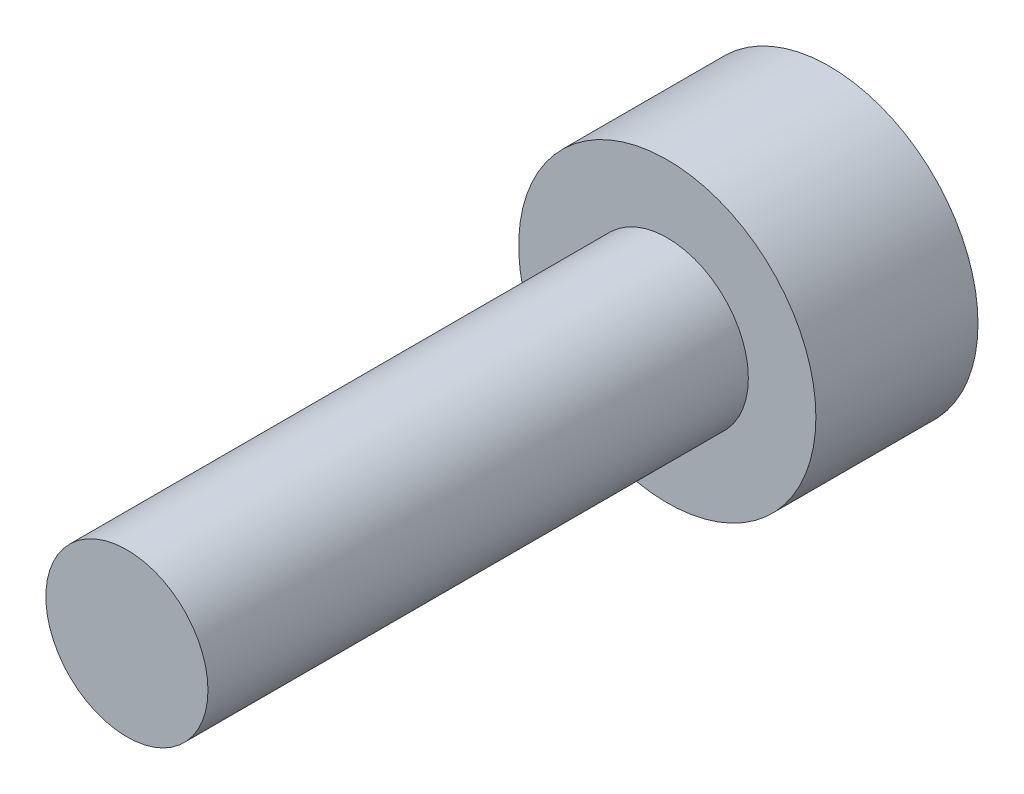
ISO-10303-21;
HEADER;
FILE_DESCRIPTION(('STEP AP214'),'2;1');
FILE_NAME('part.step','',(''),(''),'','','');
FILE_SCHEMA(('AUTOMOTIVE_DESIGN { 1 0 10303 214 1 1 1 1 }'));
ENDSEC;
DATA;
#1=APPLICATION_CONTEXT('core data for automotive mechanical design processes');
#2=APPLICATION_PROTOCOL_DEFINITION('international standard','automotive_design',2000,#1);
#3=PRODUCT_CONTEXT('',#1,'mechanical');
#4=PRODUCT('Part','Part','',(#3));
#5=PRODUCT_RELATED_PRODUCT_CATEGORY('part','',(#4));
#6=PRODUCT_DEFINITION_FORMATION('','',#4);
#7=PRODUCT_DEFINITION_CONTEXT('part definition',#1,'design');
#8=PRODUCT_DEFINITION('design','',#6,#7);
#9=PRODUCT_DEFINITION_SHAPE('','',#8);
#10=(LENGTH_UNIT() NAMED_UNIT(*) SI_UNIT(.MILLI.,.METRE.));
#11=(NAMED_UNIT(*) PLANE_ANGLE_UNIT() SI_UNIT($,.RADIAN.));
#12=(NAMED_UNIT(*) SI_UNIT($,.STERADIAN.) SOLID_ANGLE_UNIT());
#13=UNCERTAINTY_MEASURE_WITH_UNIT(LENGTH_MEASURE(1.E-05),#10,'distance_accuracy_value','');
#14=(GEOMETRIC_REPRESENTATION_CONTEXT(3) GLOBAL_UNCERTAINTY_ASSIGNED_CONTEXT((#13)) GLOBAL_UNIT_ASSIGNED_CONTEXT((#10,
#11,#12)) REPRESENTATION_CONTEXT('',''));
#15=CARTESIAN_POINT('',(0.,0.,0.));
#16=DIRECTION('',(0.,0.,1.));
#17=DIRECTION('',(1.,0.,0.));
#18=AXIS2_PLACEMENT_3D('',#15,#16,#17);
#19=CARTESIAN_POINT('',(0.,0.,3.));
#20=DIRECTION('',(0.,0.,-1.));
#21=DIRECTION('',(-1.,0.,0.));
#22=AXIS2_PLACEMENT_3D('',#19,#20,#21);
#23=CYLINDRICAL_SURFACE('',#22,2.75);
#24=CARTESIAN_POINT('',(0.,0.,3.));
#25=DIRECTION('',(0.,0.,1.));
#26=DIRECTION('',(1.,0.,0.));
#27=AXIS2_PLACEMENT_3D('',#24,#25,#26);
#28=CIRCLE('',#27,2.75);
#29=CARTESIAN_POINT('',(2.75,0.,3.));
#30=VERTEX_POINT('',#29);
#31=EDGE_CURVE('E46',#30,#30,#28,.T.);
#32=ORIENTED_EDGE('',*,*,#31,.F.);
#33=EDGE_LOOP('',(#32));
#34=FACE_BOUND('',#33,.T.);
#35=CARTESIAN_POINT('',(0.,0.,0.));
#36=DIRECTION('',(0.,0.,1.));
#37=DIRECTION('',(1.,0.,0.));
#38=AXIS2_PLACEMENT_3D('',#35,#36,#37);
#39=CIRCLE('',#38,2.75);
#40=CARTESIAN_POINT('',(2.75,0.,0.));
#41=VERTEX_POINT('',#40);
#42=EDGE_CURVE('E42',#41,#41,#39,.T.);
#43=ORIENTED_EDGE('',*,*,#42,.T.);
#44=EDGE_LOOP('',(#43));
#45=FACE_BOUND('',#44,.T.);
#46=ADVANCED_FACE('F39',(#34,#45),#23,.T.);
#47=CARTESIAN_POINT('',(0.,0.,3.));
#48=DIRECTION('',(0.,0.,1.));
#49=DIRECTION('',(1.,0.,0.));
#50=AXIS2_PLACEMENT_3D('',#47,#48,#49);
#51=PLANE('',#50);
#52=CARTESIAN_POINT('',(0.,0.,3.));
#53=DIRECTION('',(0.,0.,1.));
#54=DIRECTION('',(1.,0.,0.));
#55=AXIS2_PLACEMENT_3D('',#52,#53,#54);
#56=CIRCLE('',#55,1.5);
#57=CARTESIAN_POINT('',(1.5,0.,3.));
#58=VERTEX_POINT('',#57);
#59=EDGE_CURVE('E10',#58,#58,#56,.T.);
#60=ORIENTED_EDGE('',*,*,#59,.F.);
#61=EDGE_LOOP('',(#60));
#62=FACE_BOUND('',#61,.T.);
#63=ORIENTED_EDGE('',*,*,#31,.T.);
#64=EDGE_LOOP('',(#63));
#65=FACE_BOUND('',#64,.T.);
#66=ADVANCED_FACE('F63',(#62,#65),#51,.T.);
#67=CARTESIAN_POINT('',(0.,0.,0.));
#68=DIRECTION('',(0.,0.,1.));
#69=DIRECTION('',(1.,0.,0.));
#70=AXIS2_PLACEMENT_3D('',#67,#68,#69);
#71=PLANE('',#70);
#72=ORIENTED_EDGE('',*,*,#42,.F.);
#73=EDGE_LOOP('',(#72));
#74=FACE_BOUND('',#73,.T.);
#75=ADVANCED_FACE('F60',(#74),#71,.F.);
#76=CARTESIAN_POINT('',(0.,0.,13.));
#77=DIRECTION('',(0.,0.,-1.));
#78=DIRECTION('',(-1.,0.,0.));
#79=AXIS2_PLACEMENT_3D('',#76,#77,#78);
#80=CYLINDRICAL_SURFACE('',#79,1.5);
#81=CARTESIAN_POINT('',(0.,0.,13.));
#82=DIRECTION('',(0.,0.,1.));
#83=DIRECTION('',(1.,0.,0.));
#84=AXIS2_PLACEMENT_3D('',#81,#82,#83);
#85=CIRCLE('',#84,1.5);
#86=CARTESIAN_POINT('',(1.5,0.,13.));
#87=VERTEX_POINT('',#86);
#88=EDGE_CURVE('E52',#87,#87,#85,.T.);
#89=ORIENTED_EDGE('',*,*,#88,.F.);
#90=EDGE_LOOP('',(#89));
#91=FACE_BOUND('',#90,.T.);
#92=ORIENTED_EDGE('',*,*,#59,.T.);
#93=EDGE_LOOP('',(#92));
#94=FACE_BOUND('',#93,.T.);
#95=ADVANCED_FACE('F62',(#91,#94),#80,.T.);
#96=CARTESIAN_POINT('',(0.,0.,13.));
#97=DIRECTION('',(0.,0.,1.));
#98=DIRECTION('',(1.,0.,0.));
#99=AXIS2_PLACEMENT_3D('',#96,#97,#98);
#100=PLANE('',#99);
#101=ORIENTED_EDGE('',*,*,#88,.T.);
#102=EDGE_LOOP('',(#101));
#103=FACE_BOUND('',#102,.T.);
#104=ADVANCED_FACE('F69',(#103),#100,.T.);
#105=CLOSED_SHELL('',(#46,#66,#75,#95,#104));
#106=MANIFOLD_SOLID_BREP('B2',#105);
#107=ADVANCED_BREP_SHAPE_REPRESENTATION('',(#18,#106),#14);
#108=SHAPE_DEFINITION_REPRESENTATION(#9,#107);
ENDSEC;
END-ISO-10303-21;
